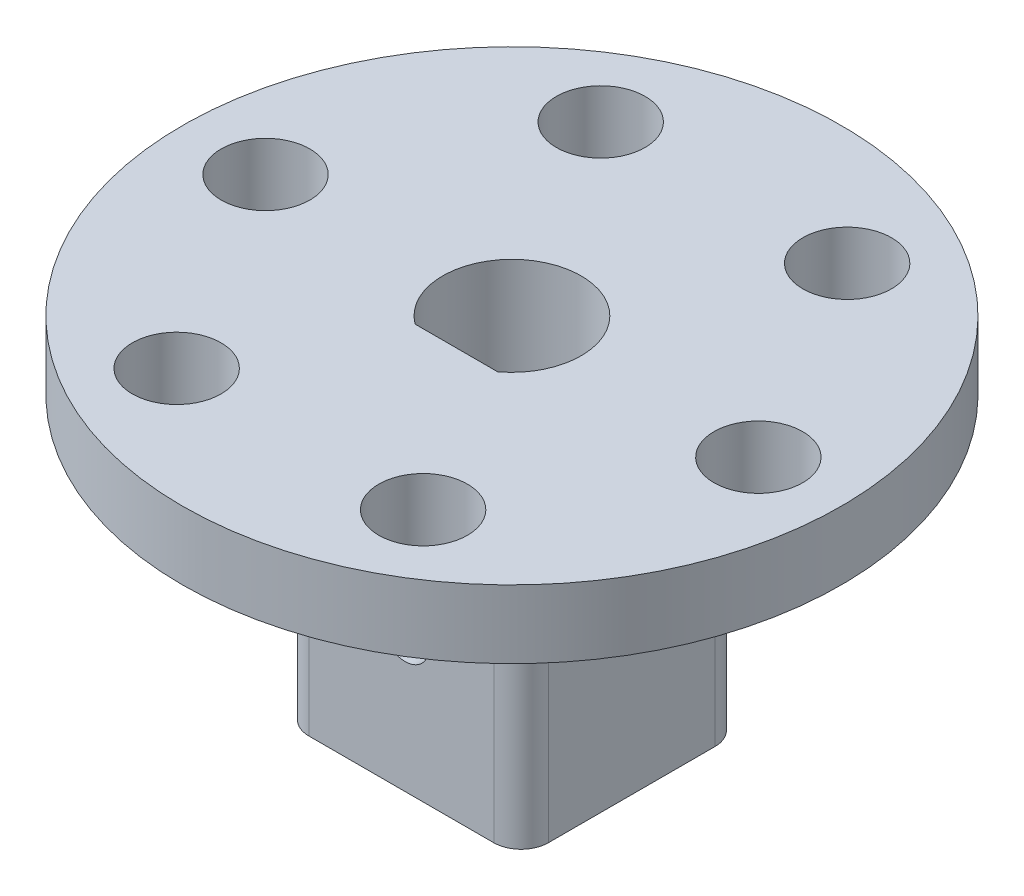
ISO-10303-21;
HEADER;
FILE_DESCRIPTION(('STEP AP214'),'2;1');
FILE_NAME('part.step','',(''),(''),'','','');
FILE_SCHEMA(('AUTOMOTIVE_DESIGN { 1 0 10303 214 1 1 1 1 }'));
ENDSEC;
DATA;
#1=APPLICATION_CONTEXT('core data for automotive mechanical design processes');
#2=APPLICATION_PROTOCOL_DEFINITION('international standard','automotive_design',2000,#1);
#3=PRODUCT_CONTEXT('',#1,'mechanical');
#4=PRODUCT('Part','Part','',(#3));
#5=PRODUCT_RELATED_PRODUCT_CATEGORY('part','',(#4));
#6=PRODUCT_DEFINITION_FORMATION('','',#4);
#7=PRODUCT_DEFINITION_CONTEXT('part definition',#1,'design');
#8=PRODUCT_DEFINITION('design','',#6,#7);
#9=PRODUCT_DEFINITION_SHAPE('','',#8);
#10=(LENGTH_UNIT() NAMED_UNIT(*) SI_UNIT(.MILLI.,.METRE.));
#11=(NAMED_UNIT(*) PLANE_ANGLE_UNIT() SI_UNIT($,.RADIAN.));
#12=(NAMED_UNIT(*) SI_UNIT($,.STERADIAN.) SOLID_ANGLE_UNIT());
#13=UNCERTAINTY_MEASURE_WITH_UNIT(LENGTH_MEASURE(1.E-05),#10,'distance_accuracy_value','');
#14=(GEOMETRIC_REPRESENTATION_CONTEXT(3) GLOBAL_UNCERTAINTY_ASSIGNED_CONTEXT((#13)) GLOBAL_UNIT_ASSIGNED_CONTEXT((#10,
#11,#12)) REPRESENTATION_CONTEXT('',''));
#15=CARTESIAN_POINT('',(0.,0.,0.));
#16=DIRECTION('',(0.,0.,1.));
#17=DIRECTION('',(1.,0.,0.));
#18=AXIS2_PLACEMENT_3D('',#15,#16,#17);
#19=CARTESIAN_POINT('',(0.,39.6654674270586,0.));
#20=DIRECTION('',(0.,-1.,0.));
#21=DIRECTION('',(0.,0.,-1.));
#22=AXIS2_PLACEMENT_3D('',#19,#20,#21);
#23=CYLINDRICAL_SURFACE('',#22,5.075);
#24=DIRECTION('',(0.,-1.,0.));
#25=VECTOR('',#24,1.);
#26=CARTESIAN_POINT('',(-3.02489669245084,39.6654674270586,4.075));
#27=LINE('',#26,#25);
#28=CARTESIAN_POINT('',(-3.02489669245084,26.,4.075));
#29=VERTEX_POINT('',#28);
#30=CARTESIAN_POINT('',(-3.02489669245084,0.,4.075));
#31=VERTEX_POINT('',#30);
#32=EDGE_CURVE('E140',#29,#31,#27,.T.);
#33=ORIENTED_EDGE('',*,*,#32,.T.);
#34=CARTESIAN_POINT('',(0.,0.,0.));
#35=DIRECTION('',(0.,-1.,0.));
#36=DIRECTION('',(0.,0.,-1.));
#37=AXIS2_PLACEMENT_3D('',#34,#35,#36);
#38=CIRCLE('',#37,5.075);
#39=CARTESIAN_POINT('',(3.02489669245083,0.,4.075));
#40=VERTEX_POINT('',#39);
#41=EDGE_CURVE('E138',#40,#31,#38,.F.);
#42=ORIENTED_EDGE('',*,*,#41,.F.);
#43=DIRECTION('',(0.,-1.,0.));
#44=VECTOR('',#43,1.);
#45=CARTESIAN_POINT('',(3.02489669245084,39.6654674270586,4.075));
#46=LINE('',#45,#44);
#47=CARTESIAN_POINT('',(3.02489669245084,26.,4.075));
#48=VERTEX_POINT('',#47);
#49=EDGE_CURVE('E73',#48,#40,#46,.T.);
#50=ORIENTED_EDGE('',*,*,#49,.F.);
#51=CARTESIAN_POINT('',(0.,26.,0.));
#52=DIRECTION('',(0.,1.,0.));
#53=DIRECTION('',(0.,0.,1.));
#54=AXIS2_PLACEMENT_3D('',#51,#52,#53);
#55=CIRCLE('',#54,5.075);
#56=EDGE_CURVE('E141',#29,#48,#55,.F.);
#57=ORIENTED_EDGE('',*,*,#56,.F.);
#58=EDGE_LOOP('',(#33,#42,#50,#57));
#59=FACE_BOUND('',#58,.T.);
#60=CARTESIAN_POINT('',(-1.47235247551351,10.,-4.85672762133612));
#61=CARTESIAN_POINT('',(-1.47235338082636,9.90378638126454,-4.85672689787604));
#62=CARTESIAN_POINT('',(-1.46439354605648,9.80757965531772,-4.85916168038422));
#63=CARTESIAN_POINT('',(-1.43285179861495,9.61799469202961,-4.86855487655554));
#64=CARTESIAN_POINT('',(-1.40926890276141,9.52461663308721,-4.87551357491473));
#65=CARTESIAN_POINT('',(-1.34733596875723,9.34342977831948,-4.89298833755643));
#66=CARTESIAN_POINT('',(-1.30900842513414,9.25561273509725,-4.90349898001583));
#67=CARTESIAN_POINT('',(-1.21872547048429,9.08760347437668,-4.92671268366572));
#68=CARTESIAN_POINT('',(-1.16676720751012,9.00741285734078,-4.93941620348019));
#69=CARTESIAN_POINT('',(-1.0489743728265,8.85451258469168,-4.96578401921006));
#70=CARTESIAN_POINT('',(-0.982797311795878,8.78206949857395,-4.97946513381106));
#71=CARTESIAN_POINT('',(-0.839153065570578,8.64913619612384,-5.00567366450237));
#72=CARTESIAN_POINT('',(-0.761685104491649,8.58864680189473,-5.01820100121114));
#73=CARTESIAN_POINT('',(-0.596448110060404,8.48068885120899,-5.04052530290643));
#74=CARTESIAN_POINT('',(-0.508568896300037,8.43338136548906,-5.05028851415392));
#75=CARTESIAN_POINT('',(-0.325728612659313,8.354293537697,-5.06536508216757));
#76=CARTESIAN_POINT('',(-0.230769779751394,8.32250831476669,-5.07067983809264));
#77=CARTESIAN_POINT('',(-0.0404399531907495,8.27647644719341,-5.07569682482576));
#78=CARTESIAN_POINT('',(0.0547729887944197,8.26159889296197,-5.07560822151543));
#79=CARTESIAN_POINT('',(0.24617645026321,8.2476550103011,-5.06992919340522));
#80=CARTESIAN_POINT('',(0.342366794631003,8.24858589779233,-5.06433973754284));
#81=CARTESIAN_POINT('',(0.530128961898967,8.26581648385653,-5.04809112451278));
#82=CARTESIAN_POINT('',(0.621754426915649,8.28168004998509,-5.03758007344505));
#83=CARTESIAN_POINT('',(0.800786922284203,8.32746698122444,-5.0122396320137));
#84=CARTESIAN_POINT('',(0.888193377074054,8.35739225870511,-4.99740965438743));
#85=CARTESIAN_POINT('',(1.05920861086101,8.43137032051179,-4.96402258372665));
#86=CARTESIAN_POINT('',(1.14262825676733,8.47581525226357,-4.94536811710966));
#87=CARTESIAN_POINT('',(1.30094969558982,8.57725623118979,-4.90610013886953));
#88=CARTESIAN_POINT('',(1.37584840716399,8.63425679699493,-4.88548592347701));
#89=CARTESIAN_POINT('',(1.51953386600463,8.76304837845582,-4.84278623362058));
#90=CARTESIAN_POINT('',(1.58772588910813,8.8354989467134,-4.82068405337145));
#91=CARTESIAN_POINT('',(1.71109666390932,8.99124155779945,-4.77828827540533));
#92=CARTESIAN_POINT('',(1.76627331605356,9.07453534642592,-4.75799496981204));
#93=CARTESIAN_POINT('',(1.8622586390479,9.25058696307277,-4.72125901491024));
#94=CARTESIAN_POINT('',(1.90297039036488,9.34340345220029,-4.70484257861885));
#95=CARTESIAN_POINT('',(1.9678975177788,9.53544685329707,-4.67806110903972));
#96=CARTESIAN_POINT('',(1.99212431105029,9.6346692763836,-4.66769188827611));
#97=CARTESIAN_POINT('',(2.0218824495284,9.82926793488124,-4.65487487771582));
#98=CARTESIAN_POINT('',(2.028599197333,9.92443020128702,-4.65192532787697));
#99=CARTESIAN_POINT('',(2.02647893994701,10.1145356463544,-4.65284986013556));
#100=CARTESIAN_POINT('',(2.01764553197466,10.2094788705999,-4.65672236408713));
#101=CARTESIAN_POINT('',(1.98563146961169,10.3917200314427,-4.67045701889568));
#102=CARTESIAN_POINT('',(1.96315680339984,10.4791664820654,-4.68002401370004));
#103=CARTESIAN_POINT('',(1.90532925844149,10.6490025274915,-4.70386194013632));
#104=CARTESIAN_POINT('',(1.86997363881056,10.7313910416745,-4.71813387285084));
#105=CARTESIAN_POINT('',(1.78560835536078,10.8928740585631,-4.75072157765718));
#106=CARTESIAN_POINT('',(1.73605538471883,10.9716530131744,-4.76919054568211));
#107=CARTESIAN_POINT('',(1.6253967098881,11.120112423116,-4.80802929164735));
#108=CARTESIAN_POINT('',(1.56428646784881,11.1897892863682,-4.82839981461839));
#109=CARTESIAN_POINT('',(1.4270408958317,11.3233345295994,-4.87080039417156));
#110=CARTESIAN_POINT('',(1.35013525019925,11.3864098278795,-4.8928432266144));
#111=CARTESIAN_POINT('',(1.18640452025575,11.498840482514,-4.93509989448841));
#112=CARTESIAN_POINT('',(1.09957853831578,11.5481945959351,-4.95531356411312));
#113=CARTESIAN_POINT('',(0.917504651228152,11.6319273877234,-4.99224270172751));
#114=CARTESIAN_POINT('',(0.822202786299461,11.6662004242094,-5.00893307900986));
#115=CARTESIAN_POINT('',(0.626407710083736,11.7178781093415,-5.03716206525825));
#116=CARTESIAN_POINT('',(0.525916793449722,11.735290147939,-5.04870292999024));
#117=CARTESIAN_POINT('',(0.328537623998129,11.7519056965102,-5.06526950189437));
#118=CARTESIAN_POINT('',(0.231756231170573,11.7520602332781,-5.07061934918489));
#119=CARTESIAN_POINT('',(0.0393566319094631,11.7363836156128,-5.07575920759616));
#120=CARTESIAN_POINT('',(-0.0562617868787917,11.720555425299,-5.07555024945792));
#121=CARTESIAN_POINT('',(-0.240255089366346,11.6742091721782,-5.07011812795967));
#122=CARTESIAN_POINT('',(-0.328765547603555,11.6442053341407,-5.06506456359179));
#123=CARTESIAN_POINT('',(-0.499635737152516,11.5706639410767,-5.05107359850572));
#124=CARTESIAN_POINT('',(-0.581994700708194,11.5271247002117,-5.04213571393914));
#125=CARTESIAN_POINT('',(-0.740544935157062,11.4264735440027,-5.02133254223304));
#126=CARTESIAN_POINT('',(-0.816524482891847,11.3690428599873,-5.00939820550276));
#127=CARTESIAN_POINT('',(-0.95808689923051,11.2427641820548,-4.98426250758063));
#128=CARTESIAN_POINT('',(-1.0236669273173,11.1739130792437,-4.97106080179584));
#129=CARTESIAN_POINT('',(-1.14531792543512,11.023429389525,-4.944483136735));
#130=CARTESIAN_POINT('',(-1.2008877900853,10.9413880244727,-4.93112228582012));
#131=CARTESIAN_POINT('',(-1.29751458954975,10.7688552373754,-4.9065850462634));
#132=CARTESIAN_POINT('',(-1.33857215971954,10.678364185481,-4.89540856199847));
#133=CARTESIAN_POINT('',(-1.40485067971924,10.4914478952791,-4.87680362917135));
#134=CARTESIAN_POINT('',(-1.43008358793938,10.395027198542,-4.86937235126539));
#135=CARTESIAN_POINT('',(-1.46383156062745,10.1990679256809,-4.85933543074354));
#136=CARTESIAN_POINT('',(-1.4723515389929,10.099530274744,-4.85672836973518));
#137=CARTESIAN_POINT('',(-1.47235247551351,10.,-4.85672762133612));
#138=B_SPLINE_CURVE_WITH_KNOTS('',3,(#60,#61,#62,#63,#64,#65,#66,#67,#68,#69,#70,#71,#72,#73,
#74,#75,#76,#77,#78,#79,#80,#81,#82,#83,#84,#85,#86,#87,#88,#89,#90,#91,#92,#93,#94,#95,#96,#97,
#98,#99,#100,#101,#102,#103,#104,#105,#106,#107,#108,#109,#110,#111,#112,#113,#114,#115,#116,
#117,#118,#119,#120,#121,#122,#123,#124,#125,#126,#127,#128,#129,#130,#131,#132,#133,#134,#135,
#136,#137),.UNSPECIFIED.,.T.,.F.,(4,2,2,2,2,2,2,2,2,2,2,2,2,2,2,2,2,2,2,2,2,2,2,2,2,2,2,2,2,2,2,
2,2,2,2,2,2,2,4),(0.,0.288276635072122,0.576571413534541,0.864428100789327,1.1523450642316,
1.44818455946741,1.74404439369492,2.04337493829834,2.34261129997355,2.63027175851191,
2.91788155669732,3.19734361349209,3.47684368767729,3.76462131993918,4.05250268982294,
4.35685211346583,4.66125059921907,4.96765181053474,5.27384059750042,5.55868751010983,
5.84346853772852,6.11463690332864,6.3858630034485,6.66930645201007,6.95286142382019,
7.25707604091732,7.56131820631573,7.86765889703203,8.17386526183973,8.46318837716944,
8.75245784515963,9.03195690081084,9.31149078210603,9.59817683942936,9.88494106759349,
10.1834817706101,10.4820094017458,10.7803111686468,11.0785252163887),.UNSPECIFIED.);
#139=CARTESIAN_POINT('',(-1.47235247551351,10.,-4.85672762133612));
#140=VERTEX_POINT('',#139);
#141=EDGE_CURVE('E60',#140,#140,#138,.T.);
#142=ORIENTED_EDGE('',*,*,#141,.F.);
#143=EDGE_LOOP('',(#142));
#144=FACE_BOUND('',#143,.T.);
#145=ADVANCED_FACE('F52',(#59,#144),#23,.F.);
#146=CARTESIAN_POINT('',(-8.77733233996759,21.,-8.1078747886141));
#147=DIRECTION('',(1.,0.,0.));
#148=DIRECTION('',(0.,0.,-1.));
#149=AXIS2_PLACEMENT_3D('',#146,#147,#148);
#150=PLANE('',#149);
#151=DIRECTION('',(0.,0.,1.));
#152=VECTOR('',#151,1.);
#153=CARTESIAN_POINT('',(-8.77733233996759,21.,-8.1078747886141));
#154=LINE('',#153,#152);
#155=CARTESIAN_POINT('',(-8.77733233996759,21.,-6.1078747886141));
#156=VERTEX_POINT('',#155);
#157=CARTESIAN_POINT('',(-8.77733233996759,21.,6.1078747886141));
#158=VERTEX_POINT('',#157);
#159=EDGE_CURVE('E262',#156,#158,#154,.T.);
#160=ORIENTED_EDGE('',*,*,#159,.F.);
#161=DIRECTION('',(0.,-1.,0.));
#162=VECTOR('',#161,1.);
#163=CARTESIAN_POINT('',(-8.77733233996759,21.,-6.1078747886141));
#164=LINE('',#163,#162);
#165=CARTESIAN_POINT('',(-8.77733233996759,0.,-6.1078747886141));
#166=VERTEX_POINT('',#165);
#167=EDGE_CURVE('E285',#156,#166,#164,.T.);
#168=ORIENTED_EDGE('',*,*,#167,.T.);
#169=DIRECTION('',(0.,0.,-1.));
#170=VECTOR('',#169,1.);
#171=CARTESIAN_POINT('',(-8.77733233996759,0.,-6.1078747886141));
#172=LINE('',#171,#170);
#173=CARTESIAN_POINT('',(-8.77733233996759,0.,6.1078747886141));
#174=VERTEX_POINT('',#173);
#175=EDGE_CURVE('E187',#174,#166,#172,.T.);
#176=ORIENTED_EDGE('',*,*,#175,.F.);
#177=DIRECTION('',(0.,-1.,0.));
#178=VECTOR('',#177,1.);
#179=CARTESIAN_POINT('',(-8.77733233996759,21.,6.1078747886141));
#180=LINE('',#179,#178);
#181=EDGE_CURVE('E277',#174,#158,#180,.F.);
#182=ORIENTED_EDGE('',*,*,#181,.T.);
#183=EDGE_LOOP('',(#160,#168,#176,#182));
#184=FACE_BOUND('',#183,.T.);
#185=ADVANCED_FACE('F333',(#184),#150,.F.);
#186=CARTESIAN_POINT('',(-8.77733233996759,21.,8.1078747886141));
#187=DIRECTION('',(0.,0.,-1.));
#188=DIRECTION('',(-1.,0.,0.));
#189=AXIS2_PLACEMENT_3D('',#186,#187,#188);
#190=PLANE('',#189);
#191=DIRECTION('',(-1.,0.,0.));
#192=VECTOR('',#191,1.);
#193=CARTESIAN_POINT('',(-6.77733233996759,0.,8.1078747886141));
#194=LINE('',#193,#192);
#195=CARTESIAN_POINT('',(6.7773323399676,0.,8.1078747886141));
#196=VERTEX_POINT('',#195);
#197=CARTESIAN_POINT('',(-6.77733233996759,0.,8.1078747886141));
#198=VERTEX_POINT('',#197);
#199=EDGE_CURVE('E162',#196,#198,#194,.T.);
#200=ORIENTED_EDGE('',*,*,#199,.F.);
#201=DIRECTION('',(0.,-1.,0.));
#202=VECTOR('',#201,1.);
#203=CARTESIAN_POINT('',(6.7773323399676,21.,8.1078747886141));
#204=LINE('',#203,#202);
#205=CARTESIAN_POINT('',(6.7773323399676,21.,8.1078747886141));
#206=VERTEX_POINT('',#205);
#207=EDGE_CURVE('E293',#196,#206,#204,.F.);
#208=ORIENTED_EDGE('',*,*,#207,.T.);
#209=DIRECTION('',(1.,0.,0.));
#210=VECTOR('',#209,1.);
#211=CARTESIAN_POINT('',(-8.77733233996759,21.,8.1078747886141));
#212=LINE('',#211,#210);
#213=CARTESIAN_POINT('',(-6.77733233996759,21.,8.1078747886141));
#214=VERTEX_POINT('',#213);
#215=EDGE_CURVE('E269',#214,#206,#212,.T.);
#216=ORIENTED_EDGE('',*,*,#215,.F.);
#217=DIRECTION('',(0.,-1.,0.));
#218=VECTOR('',#217,1.);
#219=CARTESIAN_POINT('',(-6.77733233996759,21.,8.1078747886141));
#220=LINE('',#219,#218);
#221=EDGE_CURVE('E295',#214,#198,#220,.T.);
#222=ORIENTED_EDGE('',*,*,#221,.T.);
#223=EDGE_LOOP('',(#200,#208,#216,#222));
#224=FACE_BOUND('',#223,.T.);
#225=CARTESIAN_POINT('',(0.277647524486488,10.,8.1078747886141));
#226=DIRECTION('',(0.,0.,1.));
#227=DIRECTION('',(1.,0.,0.));
#228=AXIS2_PLACEMENT_3D('',#225,#226,#227);
#229=CIRCLE('',#228,1.75);
#230=CARTESIAN_POINT('',(2.02764752448649,10.,8.1078747886141));
#231=VERTEX_POINT('',#230);
#232=EDGE_CURVE('E188',#231,#231,#229,.T.);
#233=ORIENTED_EDGE('',*,*,#232,.F.);
#234=EDGE_LOOP('',(#233));
#235=FACE_BOUND('',#234,.T.);
#236=ADVANCED_FACE('F341',(#224,#235),#190,.F.);
#237=CARTESIAN_POINT('',(8.77733233996759,21.,-8.1078747886141));
#238=DIRECTION('',(-1.,0.,0.));
#239=DIRECTION('',(0.,0.,1.));
#240=AXIS2_PLACEMENT_3D('',#237,#238,#239);
#241=PLANE('',#240);
#242=DIRECTION('',(0.,0.,-1.));
#243=VECTOR('',#242,1.);
#244=CARTESIAN_POINT('',(8.77733233996759,21.,-8.1078747886141));
#245=LINE('',#244,#243);
#246=CARTESIAN_POINT('',(8.7773323399676,21.,6.1078747886141));
#247=VERTEX_POINT('',#246);
#248=CARTESIAN_POINT('',(8.77733233996759,21.,-6.1078747886141));
#249=VERTEX_POINT('',#248);
#250=EDGE_CURVE('E275',#247,#249,#245,.T.);
#251=ORIENTED_EDGE('',*,*,#250,.F.);
#252=DIRECTION('',(0.,-1.,0.));
#253=VECTOR('',#252,1.);
#254=CARTESIAN_POINT('',(8.7773323399676,21.,6.1078747886141));
#255=LINE('',#254,#253);
#256=CARTESIAN_POINT('',(8.7773323399676,0.,6.1078747886141));
#257=VERTEX_POINT('',#256);
#258=EDGE_CURVE('E297',#247,#257,#255,.T.);
#259=ORIENTED_EDGE('',*,*,#258,.T.);
#260=DIRECTION('',(0.,0.,1.));
#261=VECTOR('',#260,1.);
#262=CARTESIAN_POINT('',(8.7773323399676,0.,6.1078747886141));
#263=LINE('',#262,#261);
#264=CARTESIAN_POINT('',(8.77733233996759,0.,-6.1078747886141));
#265=VERTEX_POINT('',#264);
#266=EDGE_CURVE('E167',#265,#257,#263,.T.);
#267=ORIENTED_EDGE('',*,*,#266,.F.);
#268=DIRECTION('',(0.,-1.,0.));
#269=VECTOR('',#268,1.);
#270=CARTESIAN_POINT('',(8.77733233996759,21.,-6.1078747886141));
#271=LINE('',#270,#269);
#272=EDGE_CURVE('E300',#265,#249,#271,.F.);
#273=ORIENTED_EDGE('',*,*,#272,.T.);
#274=EDGE_LOOP('',(#251,#259,#267,#273));
#275=FACE_BOUND('',#274,.T.);
#276=ADVANCED_FACE('F316',(#275),#241,.F.);
#277=CARTESIAN_POINT('',(-8.77733233996759,21.,-8.1078747886141));
#278=DIRECTION('',(0.,0.,1.));
#279=DIRECTION('',(1.,0.,0.));
#280=AXIS2_PLACEMENT_3D('',#277,#278,#279);
#281=PLANE('',#280);
#282=CARTESIAN_POINT('',(0.277647524486488,10.,-8.1078747886141));
#283=DIRECTION('',(0.,0.,1.));
#284=DIRECTION('',(1.,0.,0.));
#285=AXIS2_PLACEMENT_3D('',#282,#283,#284);
#286=CIRCLE('',#285,1.75);
#287=CARTESIAN_POINT('',(2.02764752448649,10.,-8.1078747886141));
#288=VERTEX_POINT('',#287);
#289=EDGE_CURVE('E200',#288,#288,#286,.F.);
#290=ORIENTED_EDGE('',*,*,#289,.F.);
#291=EDGE_LOOP('',(#290));
#292=FACE_BOUND('',#291,.T.);
#293=DIRECTION('',(0.,-1.,0.));
#294=VECTOR('',#293,1.);
#295=CARTESIAN_POINT('',(6.77733233996759,21.,-8.1078747886141));
#296=LINE('',#295,#294);
#297=CARTESIAN_POINT('',(6.77733233996759,21.,-8.1078747886141));
#298=VERTEX_POINT('',#297);
#299=CARTESIAN_POINT('',(6.77733233996759,0.,-8.1078747886141));
#300=VERTEX_POINT('',#299);
#301=EDGE_CURVE('E287',#298,#300,#296,.T.);
#302=ORIENTED_EDGE('',*,*,#301,.T.);
#303=DIRECTION('',(1.,0.,0.));
#304=VECTOR('',#303,1.);
#305=CARTESIAN_POINT('',(6.77733233996759,0.,-8.1078747886141));
#306=LINE('',#305,#304);
#307=CARTESIAN_POINT('',(-6.77733233996759,0.,-8.1078747886141));
#308=VERTEX_POINT('',#307);
#309=EDGE_CURVE('E178',#308,#300,#306,.T.);
#310=ORIENTED_EDGE('',*,*,#309,.F.);
#311=DIRECTION('',(0.,-1.,0.));
#312=VECTOR('',#311,1.);
#313=CARTESIAN_POINT('',(-6.77733233996759,21.,-8.1078747886141));
#314=LINE('',#313,#312);
#315=CARTESIAN_POINT('',(-6.77733233996759,21.,-8.1078747886141));
#316=VERTEX_POINT('',#315);
#317=EDGE_CURVE('E85',#308,#316,#314,.F.);
#318=ORIENTED_EDGE('',*,*,#317,.T.);
#319=DIRECTION('',(-1.,0.,0.));
#320=VECTOR('',#319,1.);
#321=CARTESIAN_POINT('',(-8.77733233996759,21.,-8.1078747886141));
#322=LINE('',#321,#320);
#323=EDGE_CURVE('E279',#298,#316,#322,.T.);
#324=ORIENTED_EDGE('',*,*,#323,.F.);
#325=EDGE_LOOP('',(#302,#310,#318,#324));
#326=FACE_BOUND('',#325,.T.);
#327=ADVANCED_FACE('F326',(#292,#326),#281,.F.);
#328=CARTESIAN_POINT('',(0.,21.,0.));
#329=DIRECTION('',(0.,1.,0.));
#330=DIRECTION('',(0.,0.,1.));
#331=AXIS2_PLACEMENT_3D('',#328,#329,#330);
#332=PLANE('',#331);
#333=CARTESIAN_POINT('',(0.,21.,0.));
#334=DIRECTION('',(0.,1.,0.));
#335=DIRECTION('',(0.,0.,1.));
#336=AXIS2_PLACEMENT_3D('',#333,#334,#335);
#337=CIRCLE('',#336,24.1522187879095);
#338=CARTESIAN_POINT('',(0.,21.,24.1522187879095));
#339=VERTEX_POINT('',#338);
#340=EDGE_CURVE('E254',#339,#339,#337,.T.);
#341=ORIENTED_EDGE('',*,*,#340,.F.);
#342=EDGE_LOOP('',(#341));
#343=FACE_BOUND('',#342,.T.);
#344=CARTESIAN_POINT('',(8.94909975913114,21.,-15.6177339425769));
#345=DIRECTION('',(0.,1.,0.));
#346=DIRECTION('',(0.,0.,1.));
#347=AXIS2_PLACEMENT_3D('',#344,#345,#346);
#348=CIRCLE('',#347,3.25);
#349=CARTESIAN_POINT('',(8.94909975913114,21.,-12.3677339425769));
#350=VERTEX_POINT('',#349);
#351=EDGE_CURVE('E244',#350,#350,#348,.T.);
#352=ORIENTED_EDGE('',*,*,#351,.T.);
#353=EDGE_LOOP('',(#352));
#354=FACE_BOUND('',#353,.T.);
#355=CARTESIAN_POINT('',(17.9999042233837,21.,-0.0587192388796483));
#356=DIRECTION('',(0.,1.,0.));
#357=DIRECTION('',(0.,0.,1.));
#358=AXIS2_PLACEMENT_3D('',#355,#356,#357);
#359=CIRCLE('',#358,3.25);
#360=CARTESIAN_POINT('',(17.9999042233837,21.,3.19128076112035));
#361=VERTEX_POINT('',#360);
#362=EDGE_CURVE('E240',#361,#361,#359,.T.);
#363=ORIENTED_EDGE('',*,*,#362,.T.);
#364=EDGE_LOOP('',(#363));
#365=FACE_BOUND('',#364,.T.);
#366=CARTESIAN_POINT('',(9.05080446425246,21.,15.5590147036973));
#367=DIRECTION('',(0.,1.,0.));
#368=DIRECTION('',(0.,0.,1.));
#369=AXIS2_PLACEMENT_3D('',#366,#367,#368);
#370=CIRCLE('',#369,3.25);
#371=CARTESIAN_POINT('',(9.05080446425246,21.,18.8090147036973));
#372=VERTEX_POINT('',#371);
#373=EDGE_CURVE('E230',#372,#372,#370,.T.);
#374=ORIENTED_EDGE('',*,*,#373,.T.);
#375=EDGE_LOOP('',(#374));
#376=FACE_BOUND('',#375,.T.);
#377=CARTESIAN_POINT('',(-8.94909975913125,21.,15.6177339425768));
#378=DIRECTION('',(0.,1.,0.));
#379=DIRECTION('',(0.,0.,1.));
#380=AXIS2_PLACEMENT_3D('',#377,#378,#379);
#381=CIRCLE('',#380,3.25);
#382=CARTESIAN_POINT('',(-8.94909975913125,21.,18.8677339425768));
#383=VERTEX_POINT('',#382);
#384=EDGE_CURVE('E222',#383,#383,#381,.T.);
#385=ORIENTED_EDGE('',*,*,#384,.T.);
#386=EDGE_LOOP('',(#385));
#387=FACE_BOUND('',#386,.T.);
#388=CARTESIAN_POINT('',(-17.9999042233837,21.,0.0587192388795225));
#389=DIRECTION('',(0.,1.,0.));
#390=DIRECTION('',(0.,0.,1.));
#391=AXIS2_PLACEMENT_3D('',#388,#389,#390);
#392=CIRCLE('',#391,3.25);
#393=CARTESIAN_POINT('',(-17.9999042233837,21.,3.30871923887952));
#394=VERTEX_POINT('',#393);
#395=EDGE_CURVE('E215',#394,#394,#392,.T.);
#396=ORIENTED_EDGE('',*,*,#395,.T.);
#397=EDGE_LOOP('',(#396));
#398=FACE_BOUND('',#397,.T.);
#399=CARTESIAN_POINT('',(-9.05080446425235,21.,-15.5590147036973));
#400=DIRECTION('',(0.,1.,0.));
#401=DIRECTION('',(0.,0.,1.));
#402=AXIS2_PLACEMENT_3D('',#399,#400,#401);
#403=CIRCLE('',#402,3.25);
#404=CARTESIAN_POINT('',(-9.05080446425235,21.,-12.3090147036973));
#405=VERTEX_POINT('',#404);
#406=EDGE_CURVE('E206',#405,#405,#403,.T.);
#407=ORIENTED_EDGE('',*,*,#406,.T.);
#408=EDGE_LOOP('',(#407));
#409=FACE_BOUND('',#408,.T.);
#410=ORIENTED_EDGE('',*,*,#250,.T.);
#411=CARTESIAN_POINT('',(6.77733233996759,21.,-6.1078747886141));
#412=DIRECTION('',(0.,1.,0.));
#413=DIRECTION('',(0.,0.,1.));
#414=AXIS2_PLACEMENT_3D('',#411,#412,#413);
#415=CIRCLE('',#414,2.);
#416=EDGE_CURVE('E12',#249,#298,#415,.T.);
#417=ORIENTED_EDGE('',*,*,#416,.T.);
#418=ORIENTED_EDGE('',*,*,#323,.T.);
#419=CARTESIAN_POINT('',(-6.77733233996759,21.,-6.1078747886141));
#420=DIRECTION('',(0.,1.,0.));
#421=DIRECTION('',(0.,0.,1.));
#422=AXIS2_PLACEMENT_3D('',#419,#420,#421);
#423=CIRCLE('',#422,2.);
#424=EDGE_CURVE('E303',#316,#156,#423,.T.);
#425=ORIENTED_EDGE('',*,*,#424,.T.);
#426=ORIENTED_EDGE('',*,*,#159,.T.);
#427=CARTESIAN_POINT('',(-6.77733233996759,21.,6.1078747886141));
#428=DIRECTION('',(0.,1.,0.));
#429=DIRECTION('',(0.,0.,1.));
#430=AXIS2_PLACEMENT_3D('',#427,#428,#429);
#431=CIRCLE('',#430,2.);
#432=EDGE_CURVE('E306',#158,#214,#431,.T.);
#433=ORIENTED_EDGE('',*,*,#432,.T.);
#434=ORIENTED_EDGE('',*,*,#215,.T.);
#435=CARTESIAN_POINT('',(6.7773323399676,21.,6.1078747886141));
#436=DIRECTION('',(0.,1.,0.));
#437=DIRECTION('',(0.,0.,1.));
#438=AXIS2_PLACEMENT_3D('',#435,#436,#437);
#439=CIRCLE('',#438,2.);
#440=EDGE_CURVE('E70',#206,#247,#439,.T.);
#441=ORIENTED_EDGE('',*,*,#440,.T.);
#442=EDGE_LOOP('',(#410,#417,#418,#425,#426,#433,#434,#441));
#443=FACE_BOUND('',#442,.T.);
#444=ADVANCED_FACE('F312',(#343,#354,#365,#376,#387,#398,#409,#443),#332,.F.);
#445=CARTESIAN_POINT('',(0.,26.,0.));
#446=DIRECTION('',(0.,1.,0.));
#447=DIRECTION('',(0.,0.,1.));
#448=AXIS2_PLACEMENT_3D('',#445,#446,#447);
#449=PLANE('',#448);
#450=DIRECTION('',(-1.,0.,0.));
#451=VECTOR('',#450,1.);
#452=CARTESIAN_POINT('',(-3.02489669245084,26.,4.075));
#453=LINE('',#452,#451);
#454=EDGE_CURVE('E149',#48,#29,#453,.T.);
#455=ORIENTED_EDGE('',*,*,#454,.T.);
#456=ORIENTED_EDGE('',*,*,#56,.T.);
#457=EDGE_LOOP('',(#455,#456));
#458=FACE_BOUND('',#457,.T.);
#459=CARTESIAN_POINT('',(-17.9999042233837,26.,0.0587192388795225));
#460=DIRECTION('',(0.,1.,0.));
#461=DIRECTION('',(0.,0.,1.));
#462=AXIS2_PLACEMENT_3D('',#459,#460,#461);
#463=CIRCLE('',#462,3.25);
#464=CARTESIAN_POINT('',(-17.9999042233837,26.,3.30871923887952));
#465=VERTEX_POINT('',#464);
#466=EDGE_CURVE('E219',#465,#465,#463,.T.);
#467=ORIENTED_EDGE('',*,*,#466,.F.);
#468=EDGE_LOOP('',(#467));
#469=FACE_BOUND('',#468,.T.);
#470=CARTESIAN_POINT('',(9.05080446425246,26.,15.5590147036973));
#471=DIRECTION('',(0.,1.,0.));
#472=DIRECTION('',(0.,0.,1.));
#473=AXIS2_PLACEMENT_3D('',#470,#471,#472);
#474=CIRCLE('',#473,3.25);
#475=CARTESIAN_POINT('',(9.05080446425246,26.,18.8090147036973));
#476=VERTEX_POINT('',#475);
#477=EDGE_CURVE('E231',#476,#476,#474,.T.);
#478=ORIENTED_EDGE('',*,*,#477,.F.);
#479=EDGE_LOOP('',(#478));
#480=FACE_BOUND('',#479,.T.);
#481=CARTESIAN_POINT('',(8.94909975913114,26.,-15.6177339425769));
#482=DIRECTION('',(0.,1.,0.));
#483=DIRECTION('',(0.,0.,1.));
#484=AXIS2_PLACEMENT_3D('',#481,#482,#483);
#485=CIRCLE('',#484,3.25);
#486=CARTESIAN_POINT('',(8.94909975913114,26.,-12.3677339425769));
#487=VERTEX_POINT('',#486);
#488=EDGE_CURVE('E248',#487,#487,#485,.T.);
#489=ORIENTED_EDGE('',*,*,#488,.F.);
#490=EDGE_LOOP('',(#489));
#491=FACE_BOUND('',#490,.T.);
#492=CARTESIAN_POINT('',(0.,26.,0.));
#493=DIRECTION('',(0.,1.,0.));
#494=DIRECTION('',(0.,0.,1.));
#495=AXIS2_PLACEMENT_3D('',#492,#493,#494);
#496=CIRCLE('',#495,24.1522187879095);
#497=CARTESIAN_POINT('',(0.,26.,24.1522187879095));
#498=VERTEX_POINT('',#497);
#499=EDGE_CURVE('E256',#498,#498,#496,.T.);
#500=ORIENTED_EDGE('',*,*,#499,.T.);
#501=EDGE_LOOP('',(#500));
#502=FACE_BOUND('',#501,.T.);
#503=CARTESIAN_POINT('',(17.9999042233837,26.,-0.0587192388796483));
#504=DIRECTION('',(0.,1.,0.));
#505=DIRECTION('',(0.,0.,1.));
#506=AXIS2_PLACEMENT_3D('',#503,#504,#505);
#507=CIRCLE('',#506,3.25);
#508=CARTESIAN_POINT('',(17.9999042233837,26.,3.19128076112035));
#509=VERTEX_POINT('',#508);
#510=EDGE_CURVE('E241',#509,#509,#507,.T.);
#511=ORIENTED_EDGE('',*,*,#510,.F.);
#512=EDGE_LOOP('',(#511));
#513=FACE_BOUND('',#512,.T.);
#514=CARTESIAN_POINT('',(-8.94909975913125,26.,15.6177339425768));
#515=DIRECTION('',(0.,1.,0.));
#516=DIRECTION('',(0.,0.,1.));
#517=AXIS2_PLACEMENT_3D('',#514,#515,#516);
#518=CIRCLE('',#517,3.25);
#519=CARTESIAN_POINT('',(-8.94909975913125,26.,18.8677339425768));
#520=VERTEX_POINT('',#519);
#521=EDGE_CURVE('E223',#520,#520,#518,.T.);
#522=ORIENTED_EDGE('',*,*,#521,.F.);
#523=EDGE_LOOP('',(#522));
#524=FACE_BOUND('',#523,.T.);
#525=CARTESIAN_POINT('',(-9.05080446425235,26.,-15.5590147036973));
#526=DIRECTION('',(0.,1.,0.));
#527=DIRECTION('',(0.,0.,1.));
#528=AXIS2_PLACEMENT_3D('',#525,#526,#527);
#529=CIRCLE('',#528,3.25);
#530=CARTESIAN_POINT('',(-9.05080446425235,26.,-12.3090147036973));
#531=VERTEX_POINT('',#530);
#532=EDGE_CURVE('E209',#531,#531,#529,.T.);
#533=ORIENTED_EDGE('',*,*,#532,.F.);
#534=EDGE_LOOP('',(#533));
#535=FACE_BOUND('',#534,.T.);
#536=ADVANCED_FACE('F402',(#458,#469,#480,#491,#502,#513,#524,#535),#449,.T.);
#537=CARTESIAN_POINT('',(0.,26.,0.));
#538=DIRECTION('',(0.,-1.,0.));
#539=DIRECTION('',(0.,0.,-1.));
#540=AXIS2_PLACEMENT_3D('',#537,#538,#539);
#541=CYLINDRICAL_SURFACE('',#540,24.1522187879095);
#542=ORIENTED_EDGE('',*,*,#499,.F.);
#543=EDGE_LOOP('',(#542));
#544=FACE_BOUND('',#543,.T.);
#545=ORIENTED_EDGE('',*,*,#340,.T.);
#546=EDGE_LOOP('',(#545));
#547=FACE_BOUND('',#546,.T.);
#548=ADVANCED_FACE('F403',(#544,#547),#541,.T.);
#549=CARTESIAN_POINT('',(8.94909975913114,26.,-15.6177339425769));
#550=DIRECTION('',(0.,-1.,0.));
#551=DIRECTION('',(0.,0.,-1.));
#552=AXIS2_PLACEMENT_3D('',#549,#550,#551);
#553=CYLINDRICAL_SURFACE('',#552,3.25);
#554=ORIENTED_EDGE('',*,*,#488,.T.);
#555=EDGE_LOOP('',(#554));
#556=FACE_BOUND('',#555,.T.);
#557=ORIENTED_EDGE('',*,*,#351,.F.);
#558=EDGE_LOOP('',(#557));
#559=FACE_BOUND('',#558,.T.);
#560=ADVANCED_FACE('F406',(#556,#559),#553,.F.);
#561=CARTESIAN_POINT('',(17.9999042233837,26.,-0.0587192388796483));
#562=DIRECTION('',(0.,-1.,0.));
#563=DIRECTION('',(0.,0.,-1.));
#564=AXIS2_PLACEMENT_3D('',#561,#562,#563);
#565=CYLINDRICAL_SURFACE('',#564,3.25);
#566=ORIENTED_EDGE('',*,*,#510,.T.);
#567=EDGE_LOOP('',(#566));
#568=FACE_BOUND('',#567,.T.);
#569=ORIENTED_EDGE('',*,*,#362,.F.);
#570=EDGE_LOOP('',(#569));
#571=FACE_BOUND('',#570,.T.);
#572=ADVANCED_FACE('F413',(#568,#571),#565,.F.);
#573=CARTESIAN_POINT('',(9.05080446425246,26.,15.5590147036973));
#574=DIRECTION('',(0.,-1.,0.));
#575=DIRECTION('',(0.,0.,-1.));
#576=AXIS2_PLACEMENT_3D('',#573,#574,#575);
#577=CYLINDRICAL_SURFACE('',#576,3.25);
#578=ORIENTED_EDGE('',*,*,#477,.T.);
#579=EDGE_LOOP('',(#578));
#580=FACE_BOUND('',#579,.T.);
#581=ORIENTED_EDGE('',*,*,#373,.F.);
#582=EDGE_LOOP('',(#581));
#583=FACE_BOUND('',#582,.T.);
#584=ADVANCED_FACE('F416',(#580,#583),#577,.F.);
#585=CARTESIAN_POINT('',(-8.94909975913125,26.,15.6177339425768));
#586=DIRECTION('',(0.,-1.,0.));
#587=DIRECTION('',(0.,0.,-1.));
#588=AXIS2_PLACEMENT_3D('',#585,#586,#587);
#589=CYLINDRICAL_SURFACE('',#588,3.25);
#590=ORIENTED_EDGE('',*,*,#521,.T.);
#591=EDGE_LOOP('',(#590));
#592=FACE_BOUND('',#591,.T.);
#593=ORIENTED_EDGE('',*,*,#384,.F.);
#594=EDGE_LOOP('',(#593));
#595=FACE_BOUND('',#594,.T.);
#596=ADVANCED_FACE('F421',(#592,#595),#589,.F.);
#597=CARTESIAN_POINT('',(-17.9999042233837,26.,0.0587192388795225));
#598=DIRECTION('',(0.,-1.,0.));
#599=DIRECTION('',(0.,0.,-1.));
#600=AXIS2_PLACEMENT_3D('',#597,#598,#599);
#601=CYLINDRICAL_SURFACE('',#600,3.25);
#602=ORIENTED_EDGE('',*,*,#466,.T.);
#603=EDGE_LOOP('',(#602));
#604=FACE_BOUND('',#603,.T.);
#605=ORIENTED_EDGE('',*,*,#395,.F.);
#606=EDGE_LOOP('',(#605));
#607=FACE_BOUND('',#606,.T.);
#608=ADVANCED_FACE('F364',(#604,#607),#601,.F.);
#609=CARTESIAN_POINT('',(-9.05080446425235,26.,-15.5590147036973));
#610=DIRECTION('',(0.,-1.,0.));
#611=DIRECTION('',(0.,0.,-1.));
#612=AXIS2_PLACEMENT_3D('',#609,#610,#611);
#613=CYLINDRICAL_SURFACE('',#612,3.25);
#614=ORIENTED_EDGE('',*,*,#532,.T.);
#615=EDGE_LOOP('',(#614));
#616=FACE_BOUND('',#615,.T.);
#617=ORIENTED_EDGE('',*,*,#406,.F.);
#618=EDGE_LOOP('',(#617));
#619=FACE_BOUND('',#618,.T.);
#620=ADVANCED_FACE('F353',(#616,#619),#613,.F.);
#621=CARTESIAN_POINT('',(-3.02489669245084,39.6654674270586,4.075));
#622=DIRECTION('',(0.,0.,1.));
#623=DIRECTION('',(1.,0.,0.));
#624=AXIS2_PLACEMENT_3D('',#621,#622,#623);
#625=PLANE('',#624);
#626=CARTESIAN_POINT('',(0.277647524486488,10.,4.075));
#627=DIRECTION('',(0.,0.,1.));
#628=DIRECTION('',(1.,0.,0.));
#629=AXIS2_PLACEMENT_3D('',#626,#627,#628);
#630=CIRCLE('',#629,1.75);
#631=CARTESIAN_POINT('',(2.02764752448649,10.,4.075));
#632=VERTEX_POINT('',#631);
#633=EDGE_CURVE('E193',#632,#632,#630,.F.);
#634=ORIENTED_EDGE('',*,*,#633,.F.);
#635=EDGE_LOOP('',(#634));
#636=FACE_BOUND('',#635,.T.);
#637=ORIENTED_EDGE('',*,*,#49,.T.);
#638=DIRECTION('',(1.,0.,0.));
#639=VECTOR('',#638,1.);
#640=CARTESIAN_POINT('',(-3.02489669245084,0.,4.075));
#641=LINE('',#640,#639);
#642=EDGE_CURVE('E150',#31,#40,#641,.T.);
#643=ORIENTED_EDGE('',*,*,#642,.F.);
#644=ORIENTED_EDGE('',*,*,#32,.F.);
#645=ORIENTED_EDGE('',*,*,#454,.F.);
#646=EDGE_LOOP('',(#637,#643,#644,#645));
#647=FACE_BOUND('',#646,.T.);
#648=ADVANCED_FACE('F148',(#636,#647),#625,.F.);
#649=CARTESIAN_POINT('',(-6.77733233996759,21.,-6.1078747886141));
#650=DIRECTION('',(0.,-1.,0.));
#651=DIRECTION('',(0.,0.,-1.));
#652=AXIS2_PLACEMENT_3D('',#649,#650,#651);
#653=CYLINDRICAL_SURFACE('',#652,2.);
#654=ORIENTED_EDGE('',*,*,#424,.F.);
#655=ORIENTED_EDGE('',*,*,#317,.F.);
#656=CARTESIAN_POINT('',(-6.77733233996759,0.,-6.1078747886141));
#657=DIRECTION('',(0.,-1.,0.));
#658=DIRECTION('',(0.,0.,-1.));
#659=AXIS2_PLACEMENT_3D('',#656,#657,#658);
#660=CIRCLE('',#659,2.);
#661=EDGE_CURVE('E185',#166,#308,#660,.T.);
#662=ORIENTED_EDGE('',*,*,#661,.F.);
#663=ORIENTED_EDGE('',*,*,#167,.F.);
#664=EDGE_LOOP('',(#654,#655,#662,#663));
#665=FACE_BOUND('',#664,.T.);
#666=ADVANCED_FACE('F335',(#665),#653,.T.);
#667=CARTESIAN_POINT('',(-6.77733233996759,21.,6.1078747886141));
#668=DIRECTION('',(0.,-1.,0.));
#669=DIRECTION('',(0.,0.,-1.));
#670=AXIS2_PLACEMENT_3D('',#667,#668,#669);
#671=CYLINDRICAL_SURFACE('',#670,2.);
#672=ORIENTED_EDGE('',*,*,#432,.F.);
#673=ORIENTED_EDGE('',*,*,#181,.F.);
#674=CARTESIAN_POINT('',(-6.77733233996759,0.,6.1078747886141));
#675=DIRECTION('',(0.,-1.,0.));
#676=DIRECTION('',(0.,0.,-1.));
#677=AXIS2_PLACEMENT_3D('',#674,#675,#676);
#678=CIRCLE('',#677,2.);
#679=EDGE_CURVE('E154',#198,#174,#678,.T.);
#680=ORIENTED_EDGE('',*,*,#679,.F.);
#681=ORIENTED_EDGE('',*,*,#221,.F.);
#682=EDGE_LOOP('',(#672,#673,#680,#681));
#683=FACE_BOUND('',#682,.T.);
#684=ADVANCED_FACE('F339',(#683),#671,.T.);
#685=CARTESIAN_POINT('',(6.7773323399676,21.,6.1078747886141));
#686=DIRECTION('',(0.,-1.,0.));
#687=DIRECTION('',(0.,0.,-1.));
#688=AXIS2_PLACEMENT_3D('',#685,#686,#687);
#689=CYLINDRICAL_SURFACE('',#688,2.);
#690=ORIENTED_EDGE('',*,*,#440,.F.);
#691=ORIENTED_EDGE('',*,*,#207,.F.);
#692=CARTESIAN_POINT('',(6.7773323399676,0.,6.1078747886141));
#693=DIRECTION('',(0.,-1.,0.));
#694=DIRECTION('',(0.,0.,-1.));
#695=AXIS2_PLACEMENT_3D('',#692,#693,#694);
#696=CIRCLE('',#695,2.);
#697=EDGE_CURVE('E168',#257,#196,#696,.T.);
#698=ORIENTED_EDGE('',*,*,#697,.F.);
#699=ORIENTED_EDGE('',*,*,#258,.F.);
#700=EDGE_LOOP('',(#690,#691,#698,#699));
#701=FACE_BOUND('',#700,.T.);
#702=ADVANCED_FACE('F321',(#701),#689,.T.);
#703=CARTESIAN_POINT('',(6.77733233996759,21.,-6.1078747886141));
#704=DIRECTION('',(0.,-1.,0.));
#705=DIRECTION('',(0.,0.,-1.));
#706=AXIS2_PLACEMENT_3D('',#703,#704,#705);
#707=CYLINDRICAL_SURFACE('',#706,2.);
#708=ORIENTED_EDGE('',*,*,#416,.F.);
#709=ORIENTED_EDGE('',*,*,#272,.F.);
#710=CARTESIAN_POINT('',(6.77733233996759,0.,-6.1078747886141));
#711=DIRECTION('',(0.,-1.,0.));
#712=DIRECTION('',(0.,0.,-1.));
#713=AXIS2_PLACEMENT_3D('',#710,#711,#712);
#714=CIRCLE('',#713,2.);
#715=EDGE_CURVE('E172',#300,#265,#714,.T.);
#716=ORIENTED_EDGE('',*,*,#715,.F.);
#717=ORIENTED_EDGE('',*,*,#301,.F.);
#718=EDGE_LOOP('',(#708,#709,#716,#717));
#719=FACE_BOUND('',#718,.T.);
#720=ADVANCED_FACE('F54',(#719),#707,.T.);
#721=CARTESIAN_POINT('',(0.277647524486488,10.,24.1532187879095));
#722=DIRECTION('',(0.,0.,-1.));
#723=DIRECTION('',(-1.,0.,0.));
#724=AXIS2_PLACEMENT_3D('',#721,#722,#723);
#725=CYLINDRICAL_SURFACE('',#724,1.75);
#726=ORIENTED_EDGE('',*,*,#289,.T.);
#727=EDGE_LOOP('',(#726));
#728=FACE_BOUND('',#727,.T.);
#729=ORIENTED_EDGE('',*,*,#141,.T.);
#730=EDGE_LOOP('',(#729));
#731=FACE_BOUND('',#730,.T.);
#732=ADVANCED_FACE('F352',(#728,#731),#725,.F.);
#733=ORIENTED_EDGE('',*,*,#232,.T.);
#734=EDGE_LOOP('',(#733));
#735=FACE_BOUND('',#734,.T.);
#736=ORIENTED_EDGE('',*,*,#633,.T.);
#737=EDGE_LOOP('',(#736));
#738=FACE_BOUND('',#737,.T.);
#739=ADVANCED_FACE('F350',(#735,#738),#725,.F.);
#740=CARTESIAN_POINT('',(0.,0.,0.));
#741=DIRECTION('',(0.,-1.,0.));
#742=DIRECTION('',(0.,0.,-1.));
#743=AXIS2_PLACEMENT_3D('',#740,#741,#742);
#744=PLANE('',#743);
#745=ORIENTED_EDGE('',*,*,#41,.T.);
#746=ORIENTED_EDGE('',*,*,#642,.T.);
#747=EDGE_LOOP('',(#745,#746));
#748=FACE_BOUND('',#747,.T.);
#749=ORIENTED_EDGE('',*,*,#175,.T.);
#750=ORIENTED_EDGE('',*,*,#661,.T.);
#751=ORIENTED_EDGE('',*,*,#309,.T.);
#752=ORIENTED_EDGE('',*,*,#715,.T.);
#753=ORIENTED_EDGE('',*,*,#266,.T.);
#754=ORIENTED_EDGE('',*,*,#697,.T.);
#755=ORIENTED_EDGE('',*,*,#199,.T.);
#756=ORIENTED_EDGE('',*,*,#679,.T.);
#757=EDGE_LOOP('',(#749,#750,#751,#752,#753,#754,#755,#756));
#758=FACE_BOUND('',#757,.T.);
#759=ADVANCED_FACE('F151',(#748,#758),#744,.T.);
#760=CLOSED_SHELL('',(#145,#185,#236,#276,#327,#444,#536,#548,#560,#572,#584,#596,#608,#620,
#648,#666,#684,#702,#720,#732,#739,#759));
#761=MANIFOLD_SOLID_BREP('B2',#760);
#762=ADVANCED_BREP_SHAPE_REPRESENTATION('',(#18,#761),#14);
#763=SHAPE_DEFINITION_REPRESENTATION(#9,#762);
ENDSEC;
END-ISO-10303-21;
